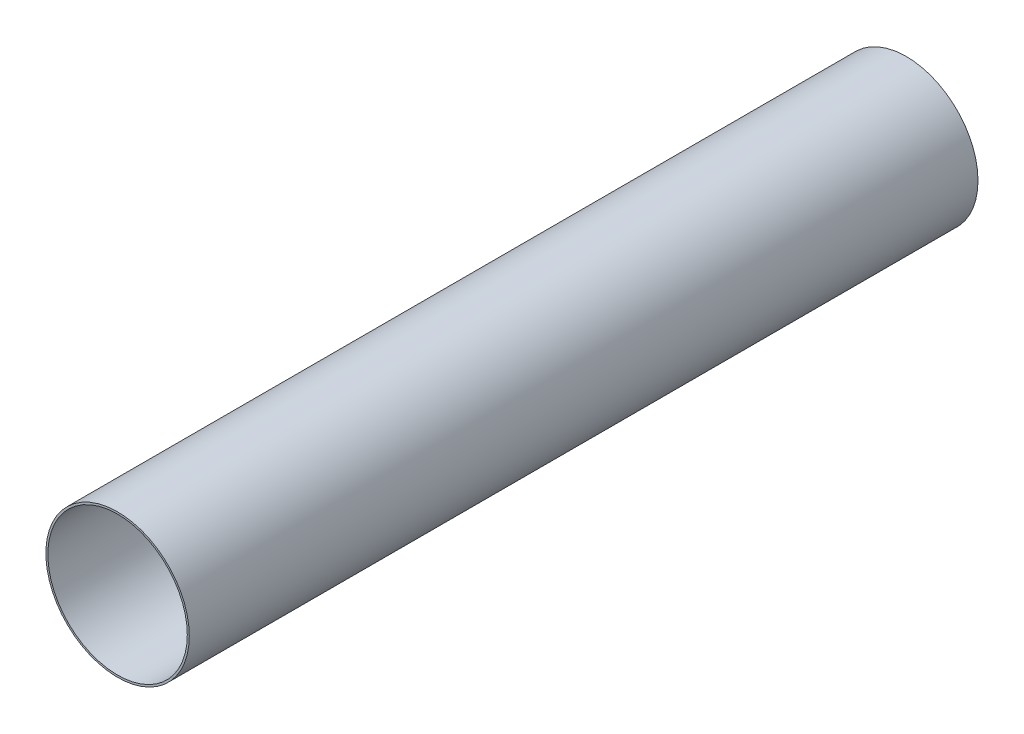
ISO-10303-21;
HEADER;
FILE_DESCRIPTION(('STEP AP214'),'2;1');
FILE_NAME('part.step','',(''),(''),'','','');
FILE_SCHEMA(('AUTOMOTIVE_DESIGN { 1 0 10303 214 1 1 1 1 }'));
ENDSEC;
DATA;
#1=APPLICATION_CONTEXT('core data for automotive mechanical design processes');
#2=APPLICATION_PROTOCOL_DEFINITION('international standard','automotive_design',2000,#1);
#3=PRODUCT_CONTEXT('',#1,'mechanical');
#4=PRODUCT('Part','Part','',(#3));
#5=PRODUCT_RELATED_PRODUCT_CATEGORY('part','',(#4));
#6=PRODUCT_DEFINITION_FORMATION('','',#4);
#7=PRODUCT_DEFINITION_CONTEXT('part definition',#1,'design');
#8=PRODUCT_DEFINITION('design','',#6,#7);
#9=PRODUCT_DEFINITION_SHAPE('','',#8);
#10=(LENGTH_UNIT() NAMED_UNIT(*) SI_UNIT(.MILLI.,.METRE.));
#11=(NAMED_UNIT(*) PLANE_ANGLE_UNIT() SI_UNIT($,.RADIAN.));
#12=(NAMED_UNIT(*) SI_UNIT($,.STERADIAN.) SOLID_ANGLE_UNIT());
#13=UNCERTAINTY_MEASURE_WITH_UNIT(LENGTH_MEASURE(1.E-05),#10,'distance_accuracy_value','');
#14=(GEOMETRIC_REPRESENTATION_CONTEXT(3) GLOBAL_UNCERTAINTY_ASSIGNED_CONTEXT((#13)) GLOBAL_UNIT_ASSIGNED_CONTEXT((#10,
#11,#12)) REPRESENTATION_CONTEXT('',''));
#15=CARTESIAN_POINT('',(0.,0.,0.));
#16=DIRECTION('',(0.,0.,1.));
#17=DIRECTION('',(1.,0.,0.));
#18=AXIS2_PLACEMENT_3D('',#15,#16,#17);
#19=CARTESIAN_POINT('',(0.,0.,558.8));
#20=DIRECTION('',(0.,0.,1.));
#21=DIRECTION('',(1.,0.,0.));
#22=AXIS2_PLACEMENT_3D('',#19,#20,#21);
#23=PLANE('',#22);
#24=CARTESIAN_POINT('',(0.,0.,558.8));
#25=DIRECTION('',(0.,0.,1.));
#26=DIRECTION('',(1.,0.,0.));
#27=AXIS2_PLACEMENT_3D('',#24,#25,#26);
#28=CIRCLE('',#27,50.8);
#29=CARTESIAN_POINT('',(50.8,0.,558.8));
#30=VERTEX_POINT('',#29);
#31=EDGE_CURVE('E10',#30,#30,#28,.T.);
#32=ORIENTED_EDGE('',*,*,#31,.T.);
#33=EDGE_LOOP('',(#32));
#34=FACE_BOUND('',#33,.T.);
#35=CARTESIAN_POINT('',(0.,0.,558.8));
#36=DIRECTION('',(0.,0.,1.));
#37=DIRECTION('',(1.,0.,0.));
#38=AXIS2_PLACEMENT_3D('',#35,#36,#37);
#39=CIRCLE('',#38,49.403);
#40=CARTESIAN_POINT('',(49.403,0.,558.8));
#41=VERTEX_POINT('',#40);
#42=EDGE_CURVE('E44',#41,#41,#39,.T.);
#43=ORIENTED_EDGE('',*,*,#42,.F.);
#44=EDGE_LOOP('',(#43));
#45=FACE_BOUND('',#44,.T.);
#46=ADVANCED_FACE('F33',(#34,#45),#23,.T.);
#47=CARTESIAN_POINT('',(0.,0.,0.));
#48=DIRECTION('',(0.,0.,1.));
#49=DIRECTION('',(1.,0.,0.));
#50=AXIS2_PLACEMENT_3D('',#47,#48,#49);
#51=PLANE('',#50);
#52=CARTESIAN_POINT('',(0.,0.,0.));
#53=DIRECTION('',(0.,0.,1.));
#54=DIRECTION('',(1.,0.,0.));
#55=AXIS2_PLACEMENT_3D('',#52,#53,#54);
#56=CIRCLE('',#55,50.8);
#57=CARTESIAN_POINT('',(50.8,0.,0.));
#58=VERTEX_POINT('',#57);
#59=EDGE_CURVE('E37',#58,#58,#56,.T.);
#60=ORIENTED_EDGE('',*,*,#59,.F.);
#61=EDGE_LOOP('',(#60));
#62=FACE_BOUND('',#61,.T.);
#63=CARTESIAN_POINT('',(0.,0.,0.));
#64=DIRECTION('',(0.,0.,1.));
#65=DIRECTION('',(1.,0.,0.));
#66=AXIS2_PLACEMENT_3D('',#63,#64,#65);
#67=CIRCLE('',#66,49.403);
#68=CARTESIAN_POINT('',(49.403,0.,0.));
#69=VERTEX_POINT('',#68);
#70=EDGE_CURVE('E46',#69,#69,#67,.T.);
#71=ORIENTED_EDGE('',*,*,#70,.T.);
#72=EDGE_LOOP('',(#71));
#73=FACE_BOUND('',#72,.T.);
#74=ADVANCED_FACE('F56',(#62,#73),#51,.F.);
#75=CARTESIAN_POINT('',(0.,0.,558.8));
#76=DIRECTION('',(0.,0.,-1.));
#77=DIRECTION('',(-1.,0.,0.));
#78=AXIS2_PLACEMENT_3D('',#75,#76,#77);
#79=CYLINDRICAL_SURFACE('',#78,50.8);
#80=ORIENTED_EDGE('',*,*,#31,.F.);
#81=EDGE_LOOP('',(#80));
#82=FACE_BOUND('',#81,.T.);
#83=ORIENTED_EDGE('',*,*,#59,.T.);
#84=EDGE_LOOP('',(#83));
#85=FACE_BOUND('',#84,.T.);
#86=ADVANCED_FACE('F35',(#82,#85),#79,.T.);
#87=CARTESIAN_POINT('',(0.,0.,558.8));
#88=DIRECTION('',(0.,0.,-1.));
#89=DIRECTION('',(-1.,0.,0.));
#90=AXIS2_PLACEMENT_3D('',#87,#88,#89);
#91=CYLINDRICAL_SURFACE('',#90,49.403);
#92=ORIENTED_EDGE('',*,*,#42,.T.);
#93=EDGE_LOOP('',(#92));
#94=FACE_BOUND('',#93,.T.);
#95=ORIENTED_EDGE('',*,*,#70,.F.);
#96=EDGE_LOOP('',(#95));
#97=FACE_BOUND('',#96,.T.);
#98=ADVANCED_FACE('F52',(#94,#97),#91,.F.);
#99=CLOSED_SHELL('',(#46,#74,#86,#98));
#100=MANIFOLD_SOLID_BREP('B2',#99);
#101=ADVANCED_BREP_SHAPE_REPRESENTATION('',(#18,#100),#14);
#102=SHAPE_DEFINITION_REPRESENTATION(#9,#101);
ENDSEC;
END-ISO-10303-21;
